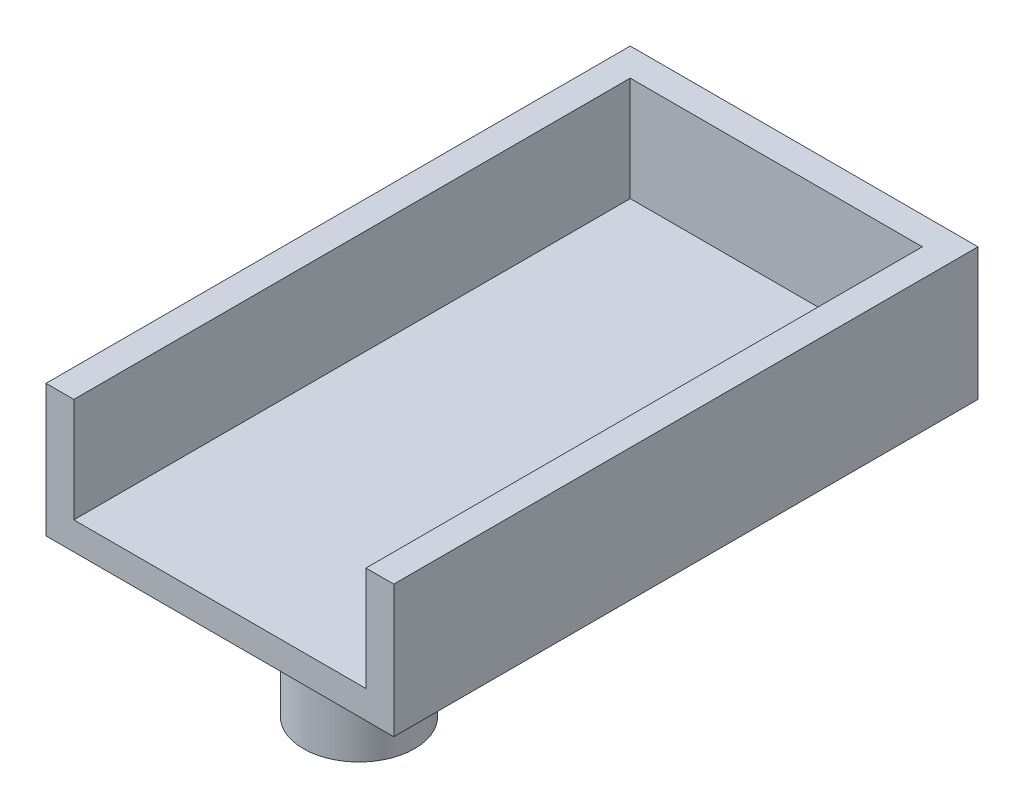
ISO-10303-21;
HEADER;
FILE_DESCRIPTION(('STEP AP214'),'2;1');
FILE_NAME('part.step','',(''),(''),'','','');
FILE_SCHEMA(('AUTOMOTIVE_DESIGN { 1 0 10303 214 1 1 1 1 }'));
ENDSEC;
DATA;
#1=APPLICATION_CONTEXT('core data for automotive mechanical design processes');
#2=APPLICATION_PROTOCOL_DEFINITION('international standard','automotive_design',2000,#1);
#3=PRODUCT_CONTEXT('',#1,'mechanical');
#4=PRODUCT('Part','Part','',(#3));
#5=PRODUCT_RELATED_PRODUCT_CATEGORY('part','',(#4));
#6=PRODUCT_DEFINITION_FORMATION('','',#4);
#7=PRODUCT_DEFINITION_CONTEXT('part definition',#1,'design');
#8=PRODUCT_DEFINITION('design','',#6,#7);
#9=PRODUCT_DEFINITION_SHAPE('','',#8);
#10=(LENGTH_UNIT() NAMED_UNIT(*) SI_UNIT(.MILLI.,.METRE.));
#11=(NAMED_UNIT(*) PLANE_ANGLE_UNIT() SI_UNIT($,.RADIAN.));
#12=(NAMED_UNIT(*) SI_UNIT($,.STERADIAN.) SOLID_ANGLE_UNIT());
#13=UNCERTAINTY_MEASURE_WITH_UNIT(LENGTH_MEASURE(1.E-05),#10,'distance_accuracy_value','');
#14=(GEOMETRIC_REPRESENTATION_CONTEXT(3) GLOBAL_UNCERTAINTY_ASSIGNED_CONTEXT((#13)) GLOBAL_UNIT_ASSIGNED_CONTEXT((#10,
#11,#12)) REPRESENTATION_CONTEXT('',''));
#15=CARTESIAN_POINT('',(0.,0.,0.));
#16=DIRECTION('',(0.,0.,1.));
#17=DIRECTION('',(1.,0.,0.));
#18=AXIS2_PLACEMENT_3D('',#15,#16,#17);
#19=CARTESIAN_POINT('',(0.,2.,0.));
#20=DIRECTION('',(0.,1.,0.));
#21=DIRECTION('',(0.,0.,1.));
#22=AXIS2_PLACEMENT_3D('',#19,#20,#21);
#23=PLANE('',#22);
#24=DIRECTION('',(1.,0.,0.));
#25=VECTOR('',#24,1.);
#26=CARTESIAN_POINT('',(0.,2.,0.));
#27=LINE('',#26,#25);
#28=CARTESIAN_POINT('',(2.,2.,0.));
#29=VERTEX_POINT('',#28);
#30=CARTESIAN_POINT('',(23.,2.,0.));
#31=VERTEX_POINT('',#30);
#32=EDGE_CURVE('E55',#29,#31,#27,.T.);
#33=ORIENTED_EDGE('',*,*,#32,.T.);
#34=DIRECTION('',(0.,0.,1.));
#35=VECTOR('',#34,1.);
#36=CARTESIAN_POINT('',(23.,2.,-40.));
#37=LINE('',#36,#35);
#38=CARTESIAN_POINT('',(23.,2.,-40.));
#39=VERTEX_POINT('',#38);
#40=EDGE_CURVE('E132',#39,#31,#37,.T.);
#41=ORIENTED_EDGE('',*,*,#40,.F.);
#42=DIRECTION('',(-1.,0.,0.));
#43=VECTOR('',#42,1.);
#44=CARTESIAN_POINT('',(0.,2.,-40.));
#45=LINE('',#44,#43);
#46=CARTESIAN_POINT('',(2.,2.,-40.));
#47=VERTEX_POINT('',#46);
#48=EDGE_CURVE('E48',#39,#47,#45,.T.);
#49=ORIENTED_EDGE('',*,*,#48,.T.);
#50=DIRECTION('',(0.,0.,-1.));
#51=VECTOR('',#50,1.);
#52=CARTESIAN_POINT('',(2.,2.,0.));
#53=LINE('',#52,#51);
#54=EDGE_CURVE('E147',#29,#47,#53,.T.);
#55=ORIENTED_EDGE('',*,*,#54,.F.);
#56=EDGE_LOOP('',(#33,#41,#49,#55));
#57=FACE_BOUND('',#56,.T.);
#58=ADVANCED_FACE('F33',(#57),#23,.T.);
#59=CARTESIAN_POINT('',(0.,2.,-40.));
#60=DIRECTION('',(1.,0.,0.));
#61=DIRECTION('',(0.,0.,-1.));
#62=AXIS2_PLACEMENT_3D('',#59,#60,#61);
#63=PLANE('',#62);
#64=DIRECTION('',(0.,0.,1.));
#65=VECTOR('',#64,1.);
#66=CARTESIAN_POINT('',(0.,0.,-40.));
#67=LINE('',#66,#65);
#68=CARTESIAN_POINT('',(0.,0.,-42.));
#69=VERTEX_POINT('',#68);
#70=CARTESIAN_POINT('',(0.,0.,0.));
#71=VERTEX_POINT('',#70);
#72=EDGE_CURVE('E114',#69,#71,#67,.T.);
#73=ORIENTED_EDGE('',*,*,#72,.T.);
#74=DIRECTION('',(0.,-1.,0.));
#75=VECTOR('',#74,1.);
#76=CARTESIAN_POINT('',(0.,2.,0.));
#77=LINE('',#76,#75);
#78=CARTESIAN_POINT('',(0.,9.5,0.));
#79=VERTEX_POINT('',#78);
#80=EDGE_CURVE('E41',#79,#71,#77,.T.);
#81=ORIENTED_EDGE('',*,*,#80,.F.);
#82=DIRECTION('',(0.,0.,1.));
#83=VECTOR('',#82,1.);
#84=CARTESIAN_POINT('',(0.,9.5,0.));
#85=LINE('',#84,#83);
#86=CARTESIAN_POINT('',(0.,9.5,-42.));
#87=VERTEX_POINT('',#86);
#88=EDGE_CURVE('E148',#87,#79,#85,.T.);
#89=ORIENTED_EDGE('',*,*,#88,.F.);
#90=DIRECTION('',(0.,-1.,0.));
#91=VECTOR('',#90,1.);
#92=CARTESIAN_POINT('',(0.,9.5,-42.));
#93=LINE('',#92,#91);
#94=EDGE_CURVE('E118',#87,#69,#93,.T.);
#95=ORIENTED_EDGE('',*,*,#94,.T.);
#96=EDGE_LOOP('',(#73,#81,#89,#95));
#97=FACE_BOUND('',#96,.T.);
#98=ADVANCED_FACE('F35',(#97),#63,.F.);
#99=CARTESIAN_POINT('',(0.,2.,0.));
#100=DIRECTION('',(0.,0.,-1.));
#101=DIRECTION('',(-1.,0.,0.));
#102=AXIS2_PLACEMENT_3D('',#99,#100,#101);
#103=PLANE('',#102);
#104=DIRECTION('',(1.,0.,0.));
#105=VECTOR('',#104,1.);
#106=CARTESIAN_POINT('',(0.,0.,0.));
#107=LINE('',#106,#105);
#108=CARTESIAN_POINT('',(25.,0.,0.));
#109=VERTEX_POINT('',#108);
#110=EDGE_CURVE('E108',#71,#109,#107,.T.);
#111=ORIENTED_EDGE('',*,*,#110,.T.);
#112=DIRECTION('',(0.,-1.,0.));
#113=VECTOR('',#112,1.);
#114=CARTESIAN_POINT('',(25.,2.,0.));
#115=LINE('',#114,#113);
#116=CARTESIAN_POINT('',(25.,9.5,0.));
#117=VERTEX_POINT('',#116);
#118=EDGE_CURVE('E106',#117,#109,#115,.T.);
#119=ORIENTED_EDGE('',*,*,#118,.F.);
#120=DIRECTION('',(1.,0.,0.));
#121=VECTOR('',#120,1.);
#122=CARTESIAN_POINT('',(25.,9.5,0.));
#123=LINE('',#122,#121);
#124=CARTESIAN_POINT('',(23.,9.5,0.));
#125=VERTEX_POINT('',#124);
#126=EDGE_CURVE('E137',#125,#117,#123,.T.);
#127=ORIENTED_EDGE('',*,*,#126,.F.);
#128=DIRECTION('',(0.,-1.,0.));
#129=VECTOR('',#128,1.);
#130=CARTESIAN_POINT('',(23.,9.5,0.));
#131=LINE('',#130,#129);
#132=EDGE_CURVE('E140',#125,#31,#131,.T.);
#133=ORIENTED_EDGE('',*,*,#132,.T.);
#134=ORIENTED_EDGE('',*,*,#32,.F.);
#135=DIRECTION('',(0.,-1.,0.));
#136=VECTOR('',#135,1.);
#137=CARTESIAN_POINT('',(2.,9.5,0.));
#138=LINE('',#137,#136);
#139=CARTESIAN_POINT('',(2.,9.5,0.));
#140=VERTEX_POINT('',#139);
#141=EDGE_CURVE('E160',#140,#29,#138,.T.);
#142=ORIENTED_EDGE('',*,*,#141,.F.);
#143=DIRECTION('',(1.,0.,0.));
#144=VECTOR('',#143,1.);
#145=CARTESIAN_POINT('',(0.,9.5,0.));
#146=LINE('',#145,#144);
#147=EDGE_CURVE('E151',#79,#140,#146,.T.);
#148=ORIENTED_EDGE('',*,*,#147,.F.);
#149=ORIENTED_EDGE('',*,*,#80,.T.);
#150=EDGE_LOOP('',(#111,#119,#127,#133,#134,#142,#148,#149));
#151=FACE_BOUND('',#150,.T.);
#152=ADVANCED_FACE('F170',(#151),#103,.F.);
#153=CARTESIAN_POINT('',(25.,2.,-40.));
#154=DIRECTION('',(-1.,0.,0.));
#155=DIRECTION('',(0.,0.,1.));
#156=AXIS2_PLACEMENT_3D('',#153,#154,#155);
#157=PLANE('',#156);
#158=DIRECTION('',(0.,0.,-1.));
#159=VECTOR('',#158,1.);
#160=CARTESIAN_POINT('',(25.,0.,-40.));
#161=LINE('',#160,#159);
#162=CARTESIAN_POINT('',(25.,0.,-42.));
#163=VERTEX_POINT('',#162);
#164=EDGE_CURVE('E99',#109,#163,#161,.T.);
#165=ORIENTED_EDGE('',*,*,#164,.T.);
#166=DIRECTION('',(0.,-1.,0.));
#167=VECTOR('',#166,1.);
#168=CARTESIAN_POINT('',(25.,9.5,-42.));
#169=LINE('',#168,#167);
#170=CARTESIAN_POINT('',(25.,9.5,-42.));
#171=VERTEX_POINT('',#170);
#172=EDGE_CURVE('E104',#171,#163,#169,.T.);
#173=ORIENTED_EDGE('',*,*,#172,.F.);
#174=DIRECTION('',(0.,0.,-1.));
#175=VECTOR('',#174,1.);
#176=CARTESIAN_POINT('',(25.,9.5,-40.));
#177=LINE('',#176,#175);
#178=EDGE_CURVE('E133',#117,#171,#177,.T.);
#179=ORIENTED_EDGE('',*,*,#178,.F.);
#180=ORIENTED_EDGE('',*,*,#118,.T.);
#181=EDGE_LOOP('',(#165,#173,#179,#180));
#182=FACE_BOUND('',#181,.T.);
#183=ADVANCED_FACE('F101',(#182),#157,.F.);
#184=CARTESIAN_POINT('',(0.,0.,0.));
#185=DIRECTION('',(0.,1.,0.));
#186=DIRECTION('',(0.,0.,1.));
#187=AXIS2_PLACEMENT_3D('',#184,#185,#186);
#188=PLANE('',#187);
#189=CARTESIAN_POINT('',(12.5,0.,-10.));
#190=DIRECTION('',(0.,1.,0.));
#191=DIRECTION('',(0.,0.,1.));
#192=AXIS2_PLACEMENT_3D('',#189,#190,#191);
#193=CIRCLE('',#192,4.);
#194=CARTESIAN_POINT('',(12.5,0.,-6.));
#195=VERTEX_POINT('',#194);
#196=EDGE_CURVE('E11',#195,#195,#193,.F.);
#197=ORIENTED_EDGE('',*,*,#196,.F.);
#198=EDGE_LOOP('',(#197));
#199=FACE_BOUND('',#198,.T.);
#200=ORIENTED_EDGE('',*,*,#72,.F.);
#201=DIRECTION('',(-1.,0.,0.));
#202=VECTOR('',#201,1.);
#203=CARTESIAN_POINT('',(25.,0.,-42.));
#204=LINE('',#203,#202);
#205=EDGE_CURVE('E111',#163,#69,#204,.T.);
#206=ORIENTED_EDGE('',*,*,#205,.F.);
#207=ORIENTED_EDGE('',*,*,#164,.F.);
#208=ORIENTED_EDGE('',*,*,#110,.F.);
#209=EDGE_LOOP('',(#200,#206,#207,#208));
#210=FACE_BOUND('',#209,.T.);
#211=ADVANCED_FACE('F112',(#199,#210),#188,.F.);
#212=CARTESIAN_POINT('',(2.,9.5,0.));
#213=DIRECTION('',(-1.,0.,0.));
#214=DIRECTION('',(0.,0.,1.));
#215=AXIS2_PLACEMENT_3D('',#212,#213,#214);
#216=PLANE('',#215);
#217=ORIENTED_EDGE('',*,*,#54,.T.);
#218=DIRECTION('',(0.,-1.,0.));
#219=VECTOR('',#218,1.);
#220=CARTESIAN_POINT('',(2.,9.5,-40.));
#221=LINE('',#220,#219);
#222=CARTESIAN_POINT('',(2.,9.5,-40.));
#223=VERTEX_POINT('',#222);
#224=EDGE_CURVE('E156',#223,#47,#221,.T.);
#225=ORIENTED_EDGE('',*,*,#224,.F.);
#226=DIRECTION('',(0.,0.,-1.));
#227=VECTOR('',#226,1.);
#228=CARTESIAN_POINT('',(2.,9.5,0.));
#229=LINE('',#228,#227);
#230=EDGE_CURVE('E153',#140,#223,#229,.T.);
#231=ORIENTED_EDGE('',*,*,#230,.F.);
#232=ORIENTED_EDGE('',*,*,#141,.T.);
#233=EDGE_LOOP('',(#217,#225,#231,#232));
#234=FACE_BOUND('',#233,.T.);
#235=ADVANCED_FACE('F183',(#234),#216,.F.);
#236=CARTESIAN_POINT('',(0.,9.5,0.));
#237=DIRECTION('',(0.,-1.,0.));
#238=DIRECTION('',(0.,0.,-1.));
#239=AXIS2_PLACEMENT_3D('',#236,#237,#238);
#240=PLANE('',#239);
#241=ORIENTED_EDGE('',*,*,#88,.T.);
#242=ORIENTED_EDGE('',*,*,#147,.T.);
#243=ORIENTED_EDGE('',*,*,#230,.T.);
#244=DIRECTION('',(-1.,0.,0.));
#245=VECTOR('',#244,1.);
#246=CARTESIAN_POINT('',(25.,9.5,-40.));
#247=LINE('',#246,#245);
#248=CARTESIAN_POINT('',(23.,9.5,-40.));
#249=VERTEX_POINT('',#248);
#250=EDGE_CURVE('E123',#249,#223,#247,.T.);
#251=ORIENTED_EDGE('',*,*,#250,.F.);
#252=DIRECTION('',(0.,0.,1.));
#253=VECTOR('',#252,1.);
#254=CARTESIAN_POINT('',(23.,9.5,-40.));
#255=LINE('',#254,#253);
#256=EDGE_CURVE('E135',#249,#125,#255,.T.);
#257=ORIENTED_EDGE('',*,*,#256,.T.);
#258=ORIENTED_EDGE('',*,*,#126,.T.);
#259=ORIENTED_EDGE('',*,*,#178,.T.);
#260=DIRECTION('',(-1.,0.,0.));
#261=VECTOR('',#260,1.);
#262=CARTESIAN_POINT('',(25.,9.5,-42.));
#263=LINE('',#262,#261);
#264=EDGE_CURVE('E122',#171,#87,#263,.T.);
#265=ORIENTED_EDGE('',*,*,#264,.T.);
#266=EDGE_LOOP('',(#241,#242,#243,#251,#257,#258,#259,#265));
#267=FACE_BOUND('',#266,.T.);
#268=ADVANCED_FACE('F174',(#267),#240,.F.);
#269=CARTESIAN_POINT('',(23.,9.5,-40.));
#270=DIRECTION('',(1.,0.,0.));
#271=DIRECTION('',(0.,0.,-1.));
#272=AXIS2_PLACEMENT_3D('',#269,#270,#271);
#273=PLANE('',#272);
#274=ORIENTED_EDGE('',*,*,#40,.T.);
#275=ORIENTED_EDGE('',*,*,#132,.F.);
#276=ORIENTED_EDGE('',*,*,#256,.F.);
#277=DIRECTION('',(0.,-1.,0.));
#278=VECTOR('',#277,1.);
#279=CARTESIAN_POINT('',(23.,9.5,-40.));
#280=LINE('',#279,#278);
#281=EDGE_CURVE('E144',#249,#39,#280,.T.);
#282=ORIENTED_EDGE('',*,*,#281,.T.);
#283=EDGE_LOOP('',(#274,#275,#276,#282));
#284=FACE_BOUND('',#283,.T.);
#285=ADVANCED_FACE('F180',(#284),#273,.F.);
#286=CARTESIAN_POINT('',(12.5,-10.,-10.));
#287=DIRECTION('',(0.,1.,0.));
#288=DIRECTION('',(0.,0.,1.));
#289=AXIS2_PLACEMENT_3D('',#286,#287,#288);
#290=CYLINDRICAL_SURFACE('',#289,4.);
#291=CARTESIAN_POINT('',(12.5,-10.,-10.));
#292=DIRECTION('',(0.,-1.,0.));
#293=DIRECTION('',(0.,0.,-1.));
#294=AXIS2_PLACEMENT_3D('',#291,#292,#293);
#295=CIRCLE('',#294,4.);
#296=CARTESIAN_POINT('',(12.5,-10.,-14.));
#297=VERTEX_POINT('',#296);
#298=EDGE_CURVE('E128',#297,#297,#295,.T.);
#299=ORIENTED_EDGE('',*,*,#298,.F.);
#300=EDGE_LOOP('',(#299));
#301=FACE_BOUND('',#300,.T.);
#302=ORIENTED_EDGE('',*,*,#196,.T.);
#303=EDGE_LOOP('',(#302));
#304=FACE_BOUND('',#303,.T.);
#305=ADVANCED_FACE('F194',(#301,#304),#290,.T.);
#306=CARTESIAN_POINT('',(12.5,-10.,-10.));
#307=DIRECTION('',(0.,-1.,0.));
#308=DIRECTION('',(0.,0.,-1.));
#309=AXIS2_PLACEMENT_3D('',#306,#307,#308);
#310=PLANE('',#309);
#311=ORIENTED_EDGE('',*,*,#298,.T.);
#312=EDGE_LOOP('',(#311));
#313=FACE_BOUND('',#312,.T.);
#314=ADVANCED_FACE('F187',(#313),#310,.T.);
#315=CARTESIAN_POINT('',(0.,0.,-40.));
#316=DIRECTION('',(0.,0.,-1.));
#317=DIRECTION('',(-1.,0.,0.));
#318=AXIS2_PLACEMENT_3D('',#315,#316,#317);
#319=PLANE('',#318);
#320=ORIENTED_EDGE('',*,*,#250,.T.);
#321=ORIENTED_EDGE('',*,*,#224,.T.);
#322=ORIENTED_EDGE('',*,*,#48,.F.);
#323=ORIENTED_EDGE('',*,*,#281,.F.);
#324=EDGE_LOOP('',(#320,#321,#322,#323));
#325=FACE_BOUND('',#324,.T.);
#326=ADVANCED_FACE('F185',(#325),#319,.F.);
#327=CARTESIAN_POINT('',(0.,0.,-42.));
#328=DIRECTION('',(0.,0.,-1.));
#329=DIRECTION('',(-1.,0.,0.));
#330=AXIS2_PLACEMENT_3D('',#327,#328,#329);
#331=PLANE('',#330);
#332=ORIENTED_EDGE('',*,*,#172,.T.);
#333=ORIENTED_EDGE('',*,*,#205,.T.);
#334=ORIENTED_EDGE('',*,*,#94,.F.);
#335=ORIENTED_EDGE('',*,*,#264,.F.);
#336=EDGE_LOOP('',(#332,#333,#334,#335));
#337=FACE_BOUND('',#336,.T.);
#338=ADVANCED_FACE('F120',(#337),#331,.T.);
#339=CLOSED_SHELL('',(#58,#98,#152,#183,#211,#235,#268,#285,#305,#314,#326,#338));
#340=MANIFOLD_SOLID_BREP('B2',#339);
#341=ADVANCED_BREP_SHAPE_REPRESENTATION('',(#18,#340),#14);
#342=SHAPE_DEFINITION_REPRESENTATION(#9,#341);
ENDSEC;
END-ISO-10303-21;
